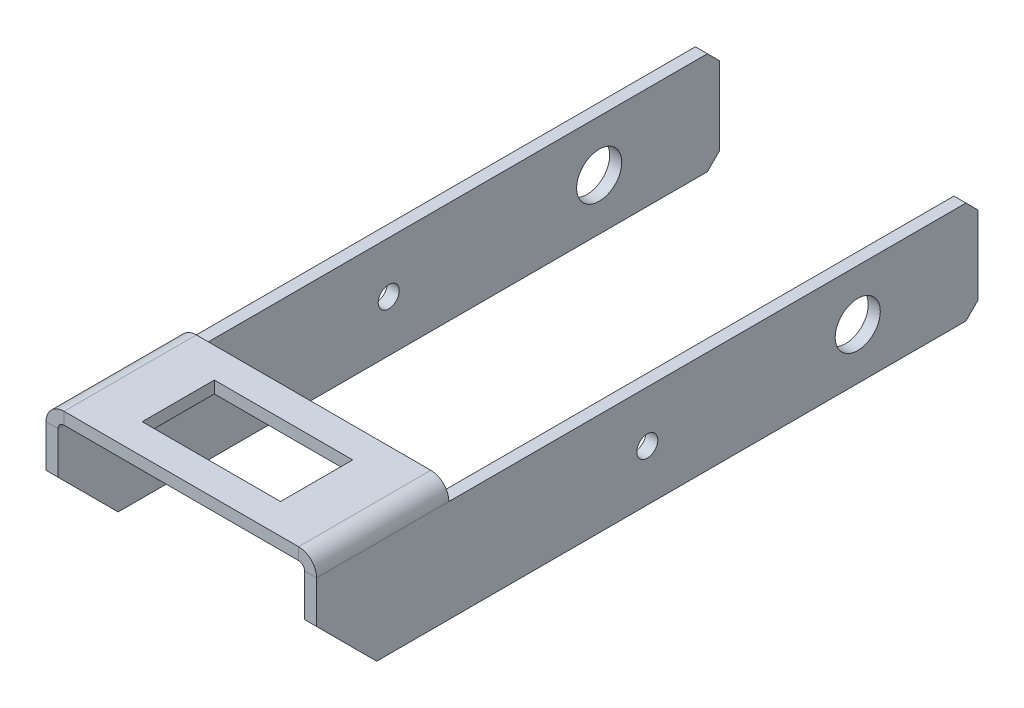
ISO-10303-21;
HEADER;
FILE_DESCRIPTION(('STEP AP214'),'2;1');
FILE_NAME('part.step','',(''),(''),'','','');
FILE_SCHEMA(('AUTOMOTIVE_DESIGN { 1 0 10303 214 1 1 1 1 }'));
ENDSEC;
DATA;
#1=APPLICATION_CONTEXT('core data for automotive mechanical design processes');
#2=APPLICATION_PROTOCOL_DEFINITION('international standard','automotive_design',2000,#1);
#3=PRODUCT_CONTEXT('',#1,'mechanical');
#4=PRODUCT('Part','Part','',(#3));
#5=PRODUCT_RELATED_PRODUCT_CATEGORY('part','',(#4));
#6=PRODUCT_DEFINITION_FORMATION('','',#4);
#7=PRODUCT_DEFINITION_CONTEXT('part definition',#1,'design');
#8=PRODUCT_DEFINITION('design','',#6,#7);
#9=PRODUCT_DEFINITION_SHAPE('','',#8);
#10=(LENGTH_UNIT() NAMED_UNIT(*) SI_UNIT(.MILLI.,.METRE.));
#11=(NAMED_UNIT(*) PLANE_ANGLE_UNIT() SI_UNIT($,.RADIAN.));
#12=(NAMED_UNIT(*) SI_UNIT($,.STERADIAN.) SOLID_ANGLE_UNIT());
#13=UNCERTAINTY_MEASURE_WITH_UNIT(LENGTH_MEASURE(1.E-05),#10,'distance_accuracy_value','');
#14=(GEOMETRIC_REPRESENTATION_CONTEXT(3) GLOBAL_UNCERTAINTY_ASSIGNED_CONTEXT((#13)) GLOBAL_UNIT_ASSIGNED_CONTEXT((#10,
#11,#12)) REPRESENTATION_CONTEXT('',''));
#15=CARTESIAN_POINT('',(0.,0.,0.));
#16=DIRECTION('',(0.,0.,1.));
#17=DIRECTION('',(1.,0.,0.));
#18=AXIS2_PLACEMENT_3D('',#15,#16,#17);
#19=CARTESIAN_POINT('',(0.,2.,0.));
#20=DIRECTION('',(0.,0.,-1.));
#21=DIRECTION('',(-1.,0.,0.));
#22=AXIS2_PLACEMENT_3D('',#19,#20,#21);
#23=PLANE('',#22);
#24=DIRECTION('',(0.,1.,0.));
#25=VECTOR('',#24,1.);
#26=CARTESIAN_POINT('',(3.,0.,0.));
#27=LINE('',#26,#25);
#28=CARTESIAN_POINT('',(3.,0.,0.));
#29=VERTEX_POINT('',#28);
#30=CARTESIAN_POINT('',(3.,2.,0.));
#31=VERTEX_POINT('',#30);
#32=EDGE_CURVE('E348',#29,#31,#27,.T.);
#33=ORIENTED_EDGE('',*,*,#32,.F.);
#34=DIRECTION('',(1.,0.,0.));
#35=VECTOR('',#34,1.);
#36=CARTESIAN_POINT('',(0.,0.,0.));
#37=LINE('',#36,#35);
#38=CARTESIAN_POINT('',(42.,0.,0.));
#39=VERTEX_POINT('',#38);
#40=EDGE_CURVE('E403',#29,#39,#37,.T.);
#41=ORIENTED_EDGE('',*,*,#40,.T.);
#42=DIRECTION('',(0.,1.,0.));
#43=VECTOR('',#42,1.);
#44=CARTESIAN_POINT('',(42.,0.,0.));
#45=LINE('',#44,#43);
#46=CARTESIAN_POINT('',(42.,2.,0.));
#47=VERTEX_POINT('',#46);
#48=EDGE_CURVE('E384',#39,#47,#45,.T.);
#49=ORIENTED_EDGE('',*,*,#48,.T.);
#50=DIRECTION('',(1.,0.,0.));
#51=VECTOR('',#50,1.);
#52=CARTESIAN_POINT('',(0.,2.,0.));
#53=LINE('',#52,#51);
#54=EDGE_CURVE('E405',#31,#47,#53,.T.);
#55=ORIENTED_EDGE('',*,*,#54,.F.);
#56=EDGE_LOOP('',(#33,#41,#49,#55));
#57=FACE_BOUND('',#56,.T.);
#58=ADVANCED_FACE('F87',(#57),#23,.F.);
#59=CARTESIAN_POINT('',(0.,2.,-22.));
#60=DIRECTION('',(0.,0.,1.));
#61=DIRECTION('',(1.,0.,0.));
#62=AXIS2_PLACEMENT_3D('',#59,#60,#61);
#63=PLANE('',#62);
#64=DIRECTION('',(0.,1.,0.));
#65=VECTOR('',#64,1.);
#66=CARTESIAN_POINT('',(3.,0.,-22.));
#67=LINE('',#66,#65);
#68=CARTESIAN_POINT('',(3.,0.,-22.));
#69=VERTEX_POINT('',#68);
#70=CARTESIAN_POINT('',(3.,2.,-22.));
#71=VERTEX_POINT('',#70);
#72=EDGE_CURVE('E334',#69,#71,#67,.T.);
#73=ORIENTED_EDGE('',*,*,#72,.T.);
#74=DIRECTION('',(-1.,0.,0.));
#75=VECTOR('',#74,1.);
#76=CARTESIAN_POINT('',(0.,2.,-22.));
#77=LINE('',#76,#75);
#78=CARTESIAN_POINT('',(42.,2.,-22.));
#79=VERTEX_POINT('',#78);
#80=EDGE_CURVE('E408',#79,#71,#77,.T.);
#81=ORIENTED_EDGE('',*,*,#80,.F.);
#82=DIRECTION('',(0.,1.,0.));
#83=VECTOR('',#82,1.);
#84=CARTESIAN_POINT('',(42.,0.,-22.));
#85=LINE('',#84,#83);
#86=CARTESIAN_POINT('',(42.,0.,-22.));
#87=VERTEX_POINT('',#86);
#88=EDGE_CURVE('E397',#87,#79,#85,.T.);
#89=ORIENTED_EDGE('',*,*,#88,.F.);
#90=DIRECTION('',(-1.,0.,0.));
#91=VECTOR('',#90,1.);
#92=CARTESIAN_POINT('',(0.,0.,-22.));
#93=LINE('',#92,#91);
#94=EDGE_CURVE('E409',#87,#69,#93,.T.);
#95=ORIENTED_EDGE('',*,*,#94,.T.);
#96=EDGE_LOOP('',(#73,#81,#89,#95));
#97=FACE_BOUND('',#96,.T.);
#98=ADVANCED_FACE('F592',(#97),#63,.F.);
#99=CARTESIAN_POINT('',(0.,2.,0.));
#100=DIRECTION('',(0.,-1.,0.));
#101=DIRECTION('',(0.,0.,-1.));
#102=AXIS2_PLACEMENT_3D('',#99,#100,#101);
#103=PLANE('',#102);
#104=DIRECTION('',(-1.,0.,0.));
#105=VECTOR('',#104,1.);
#106=CARTESIAN_POINT('',(11.,2.,-17.));
#107=LINE('',#106,#105);
#108=CARTESIAN_POINT('',(34.,2.,-17.));
#109=VERTEX_POINT('',#108);
#110=CARTESIAN_POINT('',(11.,2.,-17.));
#111=VERTEX_POINT('',#110);
#112=EDGE_CURVE('E265',#109,#111,#107,.T.);
#113=ORIENTED_EDGE('',*,*,#112,.F.);
#114=DIRECTION('',(0.,0.,-1.));
#115=VECTOR('',#114,1.);
#116=CARTESIAN_POINT('',(34.,2.,-5.00000000000001));
#117=LINE('',#116,#115);
#118=CARTESIAN_POINT('',(34.,2.,-5.00000000000001));
#119=VERTEX_POINT('',#118);
#120=EDGE_CURVE('E270',#119,#109,#117,.T.);
#121=ORIENTED_EDGE('',*,*,#120,.F.);
#122=DIRECTION('',(1.,0.,0.));
#123=VECTOR('',#122,1.);
#124=CARTESIAN_POINT('',(11.,2.,-5.00000000000001));
#125=LINE('',#124,#123);
#126=CARTESIAN_POINT('',(11.,2.,-5.00000000000001));
#127=VERTEX_POINT('',#126);
#128=EDGE_CURVE('E275',#127,#119,#125,.T.);
#129=ORIENTED_EDGE('',*,*,#128,.F.);
#130=DIRECTION('',(0.,0.,1.));
#131=VECTOR('',#130,1.);
#132=CARTESIAN_POINT('',(11.,2.,-5.00000000000001));
#133=LINE('',#132,#131);
#134=EDGE_CURVE('E254',#111,#127,#133,.T.);
#135=ORIENTED_EDGE('',*,*,#134,.F.);
#136=EDGE_LOOP('',(#113,#121,#129,#135));
#137=FACE_BOUND('',#136,.T.);
#138=DIRECTION('',(0.,0.,-1.));
#139=VECTOR('',#138,1.);
#140=CARTESIAN_POINT('',(3.,2.,-22.));
#141=LINE('',#140,#139);
#142=EDGE_CURVE('E328',#71,#31,#141,.F.);
#143=ORIENTED_EDGE('',*,*,#142,.T.);
#144=ORIENTED_EDGE('',*,*,#54,.T.);
#145=DIRECTION('',(0.,0.,1.));
#146=VECTOR('',#145,1.);
#147=CARTESIAN_POINT('',(42.,2.,0.));
#148=LINE('',#147,#146);
#149=EDGE_CURVE('E379',#47,#79,#148,.F.);
#150=ORIENTED_EDGE('',*,*,#149,.T.);
#151=ORIENTED_EDGE('',*,*,#80,.T.);
#152=EDGE_LOOP('',(#143,#144,#150,#151));
#153=FACE_BOUND('',#152,.T.);
#154=ADVANCED_FACE('F272',(#137,#153),#103,.F.);
#155=CARTESIAN_POINT('',(0.,0.,0.));
#156=DIRECTION('',(0.,-1.,0.));
#157=DIRECTION('',(0.,0.,-1.));
#158=AXIS2_PLACEMENT_3D('',#155,#156,#157);
#159=PLANE('',#158);
#160=DIRECTION('',(0.,0.,1.));
#161=VECTOR('',#160,1.);
#162=CARTESIAN_POINT('',(34.,0.,0.));
#163=LINE('',#162,#161);
#164=CARTESIAN_POINT('',(34.,0.,-17.));
#165=VERTEX_POINT('',#164);
#166=CARTESIAN_POINT('',(34.,0.,-5.00000000000001));
#167=VERTEX_POINT('',#166);
#168=EDGE_CURVE('E425',#165,#167,#163,.T.);
#169=ORIENTED_EDGE('',*,*,#168,.F.);
#170=DIRECTION('',(1.,0.,0.));
#171=VECTOR('',#170,1.);
#172=CARTESIAN_POINT('',(0.,0.,-17.));
#173=LINE('',#172,#171);
#174=CARTESIAN_POINT('',(11.,0.,-17.));
#175=VERTEX_POINT('',#174);
#176=EDGE_CURVE('E411',#175,#165,#173,.T.);
#177=ORIENTED_EDGE('',*,*,#176,.F.);
#178=DIRECTION('',(0.,0.,-1.));
#179=VECTOR('',#178,1.);
#180=CARTESIAN_POINT('',(11.,0.,0.));
#181=LINE('',#180,#179);
#182=CARTESIAN_POINT('',(11.,0.,-5.00000000000001));
#183=VERTEX_POINT('',#182);
#184=EDGE_CURVE('E257',#183,#175,#181,.T.);
#185=ORIENTED_EDGE('',*,*,#184,.F.);
#186=DIRECTION('',(-1.,0.,0.));
#187=VECTOR('',#186,1.);
#188=CARTESIAN_POINT('',(0.,0.,-5.00000000000001));
#189=LINE('',#188,#187);
#190=EDGE_CURVE('E423',#167,#183,#189,.T.);
#191=ORIENTED_EDGE('',*,*,#190,.F.);
#192=EDGE_LOOP('',(#169,#177,#185,#191));
#193=FACE_BOUND('',#192,.T.);
#194=ORIENTED_EDGE('',*,*,#40,.F.);
#195=DIRECTION('',(0.,0.,-1.));
#196=VECTOR('',#195,1.);
#197=CARTESIAN_POINT('',(3.,0.,-22.));
#198=LINE('',#197,#196);
#199=EDGE_CURVE('E343',#69,#29,#198,.F.);
#200=ORIENTED_EDGE('',*,*,#199,.F.);
#201=ORIENTED_EDGE('',*,*,#94,.F.);
#202=DIRECTION('',(0.,0.,1.));
#203=VECTOR('',#202,1.);
#204=CARTESIAN_POINT('',(42.,0.,0.));
#205=LINE('',#204,#203);
#206=EDGE_CURVE('E390',#39,#87,#205,.F.);
#207=ORIENTED_EDGE('',*,*,#206,.F.);
#208=EDGE_LOOP('',(#194,#200,#201,#207));
#209=FACE_BOUND('',#208,.T.);
#210=ADVANCED_FACE('F871',(#193,#209),#159,.T.);
#211=CARTESIAN_POINT('',(42.,-0.999999999999994,-22.));
#212=DIRECTION('',(0.,0.,-1.));
#213=DIRECTION('',(0.,1.,0.));
#214=AXIS2_PLACEMENT_3D('',#211,#212,#213);
#215=PLANE('',#214);
#216=DIRECTION('',(1.,0.,0.));
#217=VECTOR('',#216,1.);
#218=CARTESIAN_POINT('',(43.,-0.999999999999991,-22.));
#219=LINE('',#218,#217);
#220=CARTESIAN_POINT('',(43.,-0.999999999999991,-22.));
#221=VERTEX_POINT('',#220);
#222=CARTESIAN_POINT('',(45.,-0.999999999999983,-22.));
#223=VERTEX_POINT('',#222);
#224=EDGE_CURVE('E400',#221,#223,#219,.T.);
#225=ORIENTED_EDGE('',*,*,#224,.F.);
#226=CARTESIAN_POINT('',(42.,-0.999999999999994,-22.));
#227=DIRECTION('',(0.,0.,1.));
#228=DIRECTION('',(0.,-1.,0.));
#229=AXIS2_PLACEMENT_3D('',#226,#227,#228);
#230=CIRCLE('',#229,1.);
#231=EDGE_CURVE('E387',#87,#221,#230,.F.);
#232=ORIENTED_EDGE('',*,*,#231,.F.);
#233=ORIENTED_EDGE('',*,*,#88,.T.);
#234=CARTESIAN_POINT('',(42.,-0.999999999999994,-22.));
#235=DIRECTION('',(0.,0.,1.));
#236=DIRECTION('',(0.,-1.,0.));
#237=AXIS2_PLACEMENT_3D('',#234,#235,#236);
#238=CIRCLE('',#237,3.);
#239=EDGE_CURVE('E381',#79,#223,#238,.F.);
#240=ORIENTED_EDGE('',*,*,#239,.T.);
#241=EDGE_LOOP('',(#225,#232,#233,#240));
#242=FACE_BOUND('',#241,.T.);
#243=ADVANCED_FACE('F509',(#242),#215,.T.);
#244=CARTESIAN_POINT('',(42.,-0.999999999999999,0.));
#245=DIRECTION('',(0.,0.,-1.));
#246=DIRECTION('',(0.,1.,0.));
#247=AXIS2_PLACEMENT_3D('',#244,#245,#246);
#248=PLANE('',#247);
#249=CARTESIAN_POINT('',(42.,-0.999999999999999,0.));
#250=DIRECTION('',(0.,0.,1.));
#251=DIRECTION('',(0.,-1.,0.));
#252=AXIS2_PLACEMENT_3D('',#249,#250,#251);
#253=CIRCLE('',#252,1.);
#254=CARTESIAN_POINT('',(43.,-0.999999999999995,0.));
#255=VERTEX_POINT('',#254);
#256=EDGE_CURVE('E393',#255,#39,#253,.T.);
#257=ORIENTED_EDGE('',*,*,#256,.F.);
#258=DIRECTION('',(-1.,0.,0.));
#259=VECTOR('',#258,1.);
#260=CARTESIAN_POINT('',(43.,-0.999999999999994,0.));
#261=LINE('',#260,#259);
#262=CARTESIAN_POINT('',(45.,-0.999999999999989,0.));
#263=VERTEX_POINT('',#262);
#264=EDGE_CURVE('E376',#255,#263,#261,.F.);
#265=ORIENTED_EDGE('',*,*,#264,.T.);
#266=CARTESIAN_POINT('',(42.,-0.999999999999999,0.));
#267=DIRECTION('',(0.,0.,1.));
#268=DIRECTION('',(0.,-1.,0.));
#269=AXIS2_PLACEMENT_3D('',#266,#267,#268);
#270=CIRCLE('',#269,3.);
#271=EDGE_CURVE('E382',#263,#47,#270,.T.);
#272=ORIENTED_EDGE('',*,*,#271,.T.);
#273=ORIENTED_EDGE('',*,*,#48,.F.);
#274=EDGE_LOOP('',(#257,#265,#272,#273));
#275=FACE_BOUND('',#274,.T.);
#276=ADVANCED_FACE('F524',(#275),#248,.F.);
#277=CARTESIAN_POINT('',(42.,-0.999999999999999,0.));
#278=DIRECTION('',(0.,0.,1.));
#279=DIRECTION('',(1.,0.,0.));
#280=AXIS2_PLACEMENT_3D('',#277,#278,#279);
#281=CYLINDRICAL_SURFACE('',#280,3.);
#282=ORIENTED_EDGE('',*,*,#149,.F.);
#283=ORIENTED_EDGE('',*,*,#271,.F.);
#284=DIRECTION('',(0.,0.,1.));
#285=VECTOR('',#284,1.);
#286=CARTESIAN_POINT('',(45.,-0.999999999999966,-110.));
#287=LINE('',#286,#285);
#288=EDGE_CURVE('E372',#263,#223,#287,.F.);
#289=ORIENTED_EDGE('',*,*,#288,.T.);
#290=ORIENTED_EDGE('',*,*,#239,.F.);
#291=EDGE_LOOP('',(#282,#283,#289,#290));
#292=FACE_BOUND('',#291,.T.);
#293=ADVANCED_FACE('F521',(#292),#281,.T.);
#294=CARTESIAN_POINT('',(42.,-0.999999999999999,0.));
#295=DIRECTION('',(0.,0.,1.));
#296=DIRECTION('',(1.,0.,0.));
#297=AXIS2_PLACEMENT_3D('',#294,#295,#296);
#298=CYLINDRICAL_SURFACE('',#297,1.);
#299=ORIENTED_EDGE('',*,*,#206,.T.);
#300=ORIENTED_EDGE('',*,*,#231,.T.);
#301=DIRECTION('',(0.,0.,1.));
#302=VECTOR('',#301,1.);
#303=CARTESIAN_POINT('',(43.,-0.999999999999995,0.));
#304=LINE('',#303,#302);
#305=EDGE_CURVE('E360',#221,#255,#304,.T.);
#306=ORIENTED_EDGE('',*,*,#305,.T.);
#307=ORIENTED_EDGE('',*,*,#256,.T.);
#308=EDGE_LOOP('',(#299,#300,#306,#307));
#309=FACE_BOUND('',#308,.T.);
#310=ADVANCED_FACE('F513',(#309),#298,.F.);
#311=CARTESIAN_POINT('',(45.0000000000001,-18.,0.));
#312=DIRECTION('',(0.,0.,-1.));
#313=DIRECTION('',(-1.,0.,0.));
#314=AXIS2_PLACEMENT_3D('',#311,#312,#313);
#315=PLANE('',#314);
#316=DIRECTION('',(0.,1.,0.));
#317=VECTOR('',#316,1.);
#318=CARTESIAN_POINT('',(43.0000000000001,-18.,0.));
#319=LINE('',#318,#317);
#320=CARTESIAN_POINT('',(43.,-7.99999999999997,0.));
#321=VERTEX_POINT('',#320);
#322=EDGE_CURVE('E370',#255,#321,#319,.F.);
#323=ORIENTED_EDGE('',*,*,#322,.T.);
#324=DIRECTION('',(1.,0.,0.));
#325=VECTOR('',#324,1.);
#326=CARTESIAN_POINT('',(45.,-7.99999999999996,0.));
#327=LINE('',#326,#325);
#328=CARTESIAN_POINT('',(45.,-7.99999999999996,0.));
#329=VERTEX_POINT('',#328);
#330=EDGE_CURVE('E96',#321,#329,#327,.T.);
#331=ORIENTED_EDGE('',*,*,#330,.T.);
#332=DIRECTION('',(0.,-1.,0.));
#333=VECTOR('',#332,1.);
#334=CARTESIAN_POINT('',(45.,1.63108075515599E-13,0.));
#335=LINE('',#334,#333);
#336=EDGE_CURVE('E363',#263,#329,#335,.T.);
#337=ORIENTED_EDGE('',*,*,#336,.F.);
#338=ORIENTED_EDGE('',*,*,#264,.F.);
#339=EDGE_LOOP('',(#323,#331,#337,#338));
#340=FACE_BOUND('',#339,.T.);
#341=ADVANCED_FACE('F517',(#340),#315,.F.);
#342=CARTESIAN_POINT('',(45.,0.,-110.));
#343=DIRECTION('',(0.,0.,1.));
#344=DIRECTION('',(1.,0.,0.));
#345=AXIS2_PLACEMENT_3D('',#342,#343,#344);
#346=PLANE('',#345);
#347=DIRECTION('',(0.,1.,0.));
#348=VECTOR('',#347,1.);
#349=CARTESIAN_POINT('',(45.,1.63108075515599E-13,-110.));
#350=LINE('',#349,#348);
#351=CARTESIAN_POINT('',(45.0000000000001,-16.,-110.));
#352=VERTEX_POINT('',#351);
#353=CARTESIAN_POINT('',(45.,-2.99999999999995,-110.));
#354=VERTEX_POINT('',#353);
#355=EDGE_CURVE('E357',#352,#354,#350,.T.);
#356=ORIENTED_EDGE('',*,*,#355,.F.);
#357=DIRECTION('',(-1.,0.,0.));
#358=VECTOR('',#357,1.);
#359=CARTESIAN_POINT('',(45.0000000000001,-16.,-110.));
#360=LINE('',#359,#358);
#361=CARTESIAN_POINT('',(43.,-16.,-110.));
#362=VERTEX_POINT('',#361);
#363=EDGE_CURVE('E430',#352,#362,#360,.T.);
#364=ORIENTED_EDGE('',*,*,#363,.T.);
#365=DIRECTION('',(0.,-1.,0.));
#366=VECTOR('',#365,1.);
#367=CARTESIAN_POINT('',(43.,0.,-110.));
#368=LINE('',#367,#366);
#369=CARTESIAN_POINT('',(43.,-2.99999999999996,-110.));
#370=VERTEX_POINT('',#369);
#371=EDGE_CURVE('E365',#362,#370,#368,.F.);
#372=ORIENTED_EDGE('',*,*,#371,.T.);
#373=DIRECTION('',(1.,0.,0.));
#374=VECTOR('',#373,1.);
#375=CARTESIAN_POINT('',(45.,-2.99999999999995,-110.));
#376=LINE('',#375,#374);
#377=EDGE_CURVE('E427',#370,#354,#376,.T.);
#378=ORIENTED_EDGE('',*,*,#377,.T.);
#379=EDGE_LOOP('',(#356,#364,#372,#378));
#380=FACE_BOUND('',#379,.T.);
#381=ADVANCED_FACE('F494',(#380),#346,.F.);
#382=CARTESIAN_POINT('',(45.,1.63108075515599E-13,0.));
#383=DIRECTION('',(-1.,0.,0.));
#384=DIRECTION('',(0.,-1.,0.));
#385=AXIS2_PLACEMENT_3D('',#382,#383,#384);
#386=PLANE('',#385);
#387=CARTESIAN_POINT('',(45.0000000000001,-9.50000000000016,-55.));
#388=DIRECTION('',(-1.,0.,0.));
#389=DIRECTION('',(0.,-1.,0.));
#390=AXIS2_PLACEMENT_3D('',#387,#388,#389);
#391=CIRCLE('',#390,1.75);
#392=CARTESIAN_POINT('',(45.0000000000001,-11.2500000000002,-55.));
#393=VERTEX_POINT('',#392);
#394=EDGE_CURVE('E285',#393,#393,#391,.T.);
#395=ORIENTED_EDGE('',*,*,#394,.T.);
#396=EDGE_LOOP('',(#395));
#397=FACE_BOUND('',#396,.T.);
#398=CARTESIAN_POINT('',(45.,-9.49999999999997,-90.));
#399=DIRECTION('',(1.,0.,0.));
#400=DIRECTION('',(0.,1.,0.));
#401=AXIS2_PLACEMENT_3D('',#398,#399,#400);
#402=CIRCLE('',#401,3.75000000000001);
#403=CARTESIAN_POINT('',(45.,-5.74999999999996,-90.));
#404=VERTEX_POINT('',#403);
#405=EDGE_CURVE('E298',#404,#404,#402,.T.);
#406=ORIENTED_EDGE('',*,*,#405,.F.);
#407=EDGE_LOOP('',(#406));
#408=FACE_BOUND('',#407,.T.);
#409=ORIENTED_EDGE('',*,*,#336,.T.);
#410=DIRECTION('',(0.,0.707106781186549,0.707106781186546));
#411=VECTOR('',#410,1.);
#412=CARTESIAN_POINT('',(45.0000000000001,-18.,-9.99999999999999));
#413=LINE('',#412,#411);
#414=CARTESIAN_POINT('',(45.0000000000001,-18.,-9.99999999999999));
#415=VERTEX_POINT('',#414);
#416=EDGE_CURVE('E13',#329,#415,#413,.F.);
#417=ORIENTED_EDGE('',*,*,#416,.T.);
#418=DIRECTION('',(0.,0.,-1.));
#419=VECTOR('',#418,1.);
#420=CARTESIAN_POINT('',(45.0000000000001,-18.,0.));
#421=LINE('',#420,#419);
#422=CARTESIAN_POINT('',(45.0000000000001,-18.,-108.));
#423=VERTEX_POINT('',#422);
#424=EDGE_CURVE('E361',#415,#423,#421,.T.);
#425=ORIENTED_EDGE('',*,*,#424,.T.);
#426=DIRECTION('',(0.,-0.707106781186545,0.70710678118655));
#427=VECTOR('',#426,1.);
#428=CARTESIAN_POINT('',(45.0000000000001,-16.,-110.));
#429=LINE('',#428,#427);
#430=EDGE_CURVE('E443',#423,#352,#429,.F.);
#431=ORIENTED_EDGE('',*,*,#430,.T.);
#432=ORIENTED_EDGE('',*,*,#355,.T.);
#433=DIRECTION('',(0.,0.707106781186545,0.70710678118655));
#434=VECTOR('',#433,1.);
#435=CARTESIAN_POINT('',(45.,-2.99999999999995,-110.));
#436=LINE('',#435,#434);
#437=CARTESIAN_POINT('',(45.,-0.999999999999967,-108.));
#438=VERTEX_POINT('',#437);
#439=EDGE_CURVE('E441',#354,#438,#436,.T.);
#440=ORIENTED_EDGE('',*,*,#439,.T.);
#441=EDGE_CURVE('E375',#223,#438,#287,.F.);
#442=ORIENTED_EDGE('',*,*,#441,.F.);
#443=ORIENTED_EDGE('',*,*,#288,.F.);
#444=EDGE_LOOP('',(#409,#417,#425,#431,#432,#440,#442,#443));
#445=FACE_BOUND('',#444,.T.);
#446=ADVANCED_FACE('F492',(#397,#408,#445),#386,.F.);
#447=CARTESIAN_POINT('',(43.,1.56125112837913E-13,0.));
#448=DIRECTION('',(-1.,0.,0.));
#449=DIRECTION('',(0.,-1.,0.));
#450=AXIS2_PLACEMENT_3D('',#447,#448,#449);
#451=PLANE('',#450);
#452=CARTESIAN_POINT('',(43.,-9.50000000000015,-55.));
#453=DIRECTION('',(-1.,0.,0.));
#454=DIRECTION('',(0.,-1.,0.));
#455=AXIS2_PLACEMENT_3D('',#452,#453,#454);
#456=CIRCLE('',#455,1.75);
#457=CARTESIAN_POINT('',(43.,-11.2500000000002,-55.));
#458=VERTEX_POINT('',#457);
#459=EDGE_CURVE('E291',#458,#458,#456,.T.);
#460=ORIENTED_EDGE('',*,*,#459,.F.);
#461=EDGE_LOOP('',(#460));
#462=FACE_BOUND('',#461,.T.);
#463=CARTESIAN_POINT('',(43.,-9.49999999999998,-90.));
#464=DIRECTION('',(-1.,0.,0.));
#465=DIRECTION('',(0.,-1.,0.));
#466=AXIS2_PLACEMENT_3D('',#463,#464,#465);
#467=CIRCLE('',#466,3.75000000000001);
#468=CARTESIAN_POINT('',(43.,-13.25,-90.));
#469=VERTEX_POINT('',#468);
#470=EDGE_CURVE('E301',#469,#469,#467,.T.);
#471=ORIENTED_EDGE('',*,*,#470,.F.);
#472=EDGE_LOOP('',(#471));
#473=FACE_BOUND('',#472,.T.);
#474=DIRECTION('',(0.,0.,1.));
#475=VECTOR('',#474,1.);
#476=CARTESIAN_POINT('',(43.0000000000001,-18.,-110.));
#477=LINE('',#476,#475);
#478=CARTESIAN_POINT('',(43.0000000000001,-18.,-9.99999999999999));
#479=VERTEX_POINT('',#478);
#480=CARTESIAN_POINT('',(43.0000000000001,-18.,-108.));
#481=VERTEX_POINT('',#480);
#482=EDGE_CURVE('E368',#479,#481,#477,.F.);
#483=ORIENTED_EDGE('',*,*,#482,.F.);
#484=DIRECTION('',(0.,-0.707106781186549,-0.707106781186546));
#485=VECTOR('',#484,1.);
#486=CARTESIAN_POINT('',(43.,-3.99999999999989,4.00000000000006));
#487=LINE('',#486,#485);
#488=EDGE_CURVE('E110',#479,#321,#487,.F.);
#489=ORIENTED_EDGE('',*,*,#488,.T.);
#490=ORIENTED_EDGE('',*,*,#322,.F.);
#491=ORIENTED_EDGE('',*,*,#305,.F.);
#492=DIRECTION('',(0.,0.,1.));
#493=VECTOR('',#492,1.);
#494=CARTESIAN_POINT('',(43.,-0.999999999999973,-110.));
#495=LINE('',#494,#493);
#496=CARTESIAN_POINT('',(43.,-0.999999999999974,-108.));
#497=VERTEX_POINT('',#496);
#498=EDGE_CURVE('E354',#497,#221,#495,.T.);
#499=ORIENTED_EDGE('',*,*,#498,.F.);
#500=DIRECTION('',(0.,-0.707106781186545,-0.70710678118655));
#501=VECTOR('',#500,1.);
#502=CARTESIAN_POINT('',(42.9999999999998,53.5000000000001,-53.4999999999996));
#503=LINE('',#502,#501);
#504=EDGE_CURVE('E433',#497,#370,#503,.T.);
#505=ORIENTED_EDGE('',*,*,#504,.T.);
#506=ORIENTED_EDGE('',*,*,#371,.F.);
#507=DIRECTION('',(0.,0.707106781186545,-0.70710678118655));
#508=VECTOR('',#507,1.);
#509=CARTESIAN_POINT('',(43.0000000000002,-63.,-62.9999999999997));
#510=LINE('',#509,#508);
#511=EDGE_CURVE('E435',#362,#481,#510,.F.);
#512=ORIENTED_EDGE('',*,*,#511,.T.);
#513=EDGE_LOOP('',(#483,#489,#490,#491,#499,#505,#506,#512));
#514=FACE_BOUND('',#513,.T.);
#515=ADVANCED_FACE('F483',(#462,#473,#514),#451,.T.);
#516=CARTESIAN_POINT('',(45.0000000000001,-18.,-110.));
#517=DIRECTION('',(0.,1.,0.));
#518=DIRECTION('',(-1.,0.,0.));
#519=AXIS2_PLACEMENT_3D('',#516,#517,#518);
#520=PLANE('',#519);
#521=ORIENTED_EDGE('',*,*,#424,.F.);
#522=DIRECTION('',(-1.,0.,0.));
#523=VECTOR('',#522,1.);
#524=CARTESIAN_POINT('',(45.0000000000001,-18.,-9.99999999999999));
#525=LINE('',#524,#523);
#526=EDGE_CURVE('E474',#415,#479,#525,.T.);
#527=ORIENTED_EDGE('',*,*,#526,.T.);
#528=ORIENTED_EDGE('',*,*,#482,.T.);
#529=DIRECTION('',(1.,0.,0.));
#530=VECTOR('',#529,1.);
#531=CARTESIAN_POINT('',(45.0000000000001,-18.,-108.));
#532=LINE('',#531,#530);
#533=EDGE_CURVE('E438',#481,#423,#532,.T.);
#534=ORIENTED_EDGE('',*,*,#533,.T.);
#535=EDGE_LOOP('',(#521,#527,#528,#534));
#536=FACE_BOUND('',#535,.T.);
#537=ADVANCED_FACE('F480',(#536),#520,.F.);
#538=CARTESIAN_POINT('',(43.,-0.999999999999973,-110.));
#539=DIRECTION('',(0.,1.,0.));
#540=DIRECTION('',(-1.,0.,0.));
#541=AXIS2_PLACEMENT_3D('',#538,#539,#540);
#542=PLANE('',#541);
#543=ORIENTED_EDGE('',*,*,#441,.T.);
#544=DIRECTION('',(-1.,0.,0.));
#545=VECTOR('',#544,1.);
#546=CARTESIAN_POINT('',(43.,-0.999999999999974,-108.));
#547=LINE('',#546,#545);
#548=EDGE_CURVE('E445',#438,#497,#547,.T.);
#549=ORIENTED_EDGE('',*,*,#548,.T.);
#550=ORIENTED_EDGE('',*,*,#498,.T.);
#551=ORIENTED_EDGE('',*,*,#224,.T.);
#552=EDGE_LOOP('',(#543,#549,#550,#551));
#553=FACE_BOUND('',#552,.T.);
#554=ADVANCED_FACE('F504',(#553),#542,.T.);
#555=CARTESIAN_POINT('',(3.,-0.999999999999996,0.));
#556=DIRECTION('',(0.,0.,1.));
#557=DIRECTION('',(0.,-1.,0.));
#558=AXIS2_PLACEMENT_3D('',#555,#556,#557);
#559=PLANE('',#558);
#560=DIRECTION('',(1.,0.,0.));
#561=VECTOR('',#560,1.);
#562=CARTESIAN_POINT('',(0.,-0.99999999999999,0.));
#563=LINE('',#562,#561);
#564=CARTESIAN_POINT('',(2.,-0.999999999999997,0.));
#565=VERTEX_POINT('',#564);
#566=CARTESIAN_POINT('',(0.,-0.99999999999999,0.));
#567=VERTEX_POINT('',#566);
#568=EDGE_CURVE('E325',#565,#567,#563,.F.);
#569=ORIENTED_EDGE('',*,*,#568,.F.);
#570=CARTESIAN_POINT('',(3.,-0.999999999999996,0.));
#571=DIRECTION('',(0.,0.,-1.));
#572=DIRECTION('',(0.,1.,0.));
#573=AXIS2_PLACEMENT_3D('',#570,#571,#572);
#574=CIRCLE('',#573,1.);
#575=EDGE_CURVE('E338',#29,#565,#574,.F.);
#576=ORIENTED_EDGE('',*,*,#575,.F.);
#577=ORIENTED_EDGE('',*,*,#32,.T.);
#578=CARTESIAN_POINT('',(3.,-0.999999999999996,0.));
#579=DIRECTION('',(0.,0.,-1.));
#580=DIRECTION('',(0.,1.,0.));
#581=AXIS2_PLACEMENT_3D('',#578,#579,#580);
#582=CIRCLE('',#581,3.);
#583=EDGE_CURVE('E330',#31,#567,#582,.F.);
#584=ORIENTED_EDGE('',*,*,#583,.T.);
#585=EDGE_LOOP('',(#569,#576,#577,#584));
#586=FACE_BOUND('',#585,.T.);
#587=ADVANCED_FACE('F556',(#586),#559,.T.);
#588=CARTESIAN_POINT('',(3.,-1.,-22.));
#589=DIRECTION('',(0.,0.,1.));
#590=DIRECTION('',(0.,-1.,0.));
#591=AXIS2_PLACEMENT_3D('',#588,#589,#590);
#592=PLANE('',#591);
#593=CARTESIAN_POINT('',(3.,-1.,-22.));
#594=DIRECTION('',(0.,0.,-1.));
#595=DIRECTION('',(0.,1.,0.));
#596=AXIS2_PLACEMENT_3D('',#593,#594,#595);
#597=CIRCLE('',#596,1.);
#598=CARTESIAN_POINT('',(2.,-1.,-22.));
#599=VERTEX_POINT('',#598);
#600=EDGE_CURVE('E304',#599,#69,#597,.T.);
#601=ORIENTED_EDGE('',*,*,#600,.F.);
#602=DIRECTION('',(-1.,0.,0.));
#603=VECTOR('',#602,1.);
#604=CARTESIAN_POINT('',(2.,-0.999999999999997,-22.));
#605=LINE('',#604,#603);
#606=CARTESIAN_POINT('',(0.,-0.99999999999999,-22.));
#607=VERTEX_POINT('',#606);
#608=EDGE_CURVE('E351',#599,#607,#605,.T.);
#609=ORIENTED_EDGE('',*,*,#608,.T.);
#610=CARTESIAN_POINT('',(3.,-1.,-22.));
#611=DIRECTION('',(0.,0.,-1.));
#612=DIRECTION('',(0.,1.,0.));
#613=AXIS2_PLACEMENT_3D('',#610,#611,#612);
#614=CIRCLE('',#613,3.);
#615=EDGE_CURVE('E331',#607,#71,#614,.T.);
#616=ORIENTED_EDGE('',*,*,#615,.T.);
#617=ORIENTED_EDGE('',*,*,#72,.F.);
#618=EDGE_LOOP('',(#601,#609,#616,#617));
#619=FACE_BOUND('',#618,.T.);
#620=ADVANCED_FACE('F538',(#619),#592,.F.);
#621=CARTESIAN_POINT('',(3.,-1.,-22.));
#622=DIRECTION('',(0.,0.,-1.));
#623=DIRECTION('',(-1.,0.,0.));
#624=AXIS2_PLACEMENT_3D('',#621,#622,#623);
#625=CYLINDRICAL_SURFACE('',#624,3.);
#626=ORIENTED_EDGE('',*,*,#142,.F.);
#627=ORIENTED_EDGE('',*,*,#615,.F.);
#628=DIRECTION('',(0.,0.,-1.));
#629=VECTOR('',#628,1.);
#630=CARTESIAN_POINT('',(0.,-0.99999999999999,-22.));
#631=LINE('',#630,#629);
#632=EDGE_CURVE('E335',#567,#607,#631,.T.);
#633=ORIENTED_EDGE('',*,*,#632,.F.);
#634=ORIENTED_EDGE('',*,*,#583,.F.);
#635=EDGE_LOOP('',(#626,#627,#633,#634));
#636=FACE_BOUND('',#635,.T.);
#637=ADVANCED_FACE('F533',(#636),#625,.T.);
#638=CARTESIAN_POINT('',(3.,-1.,-22.));
#639=DIRECTION('',(0.,0.,-1.));
#640=DIRECTION('',(-1.,0.,0.));
#641=AXIS2_PLACEMENT_3D('',#638,#639,#640);
#642=CYLINDRICAL_SURFACE('',#641,1.);
#643=ORIENTED_EDGE('',*,*,#199,.T.);
#644=ORIENTED_EDGE('',*,*,#575,.T.);
#645=DIRECTION('',(0.,0.,-1.));
#646=VECTOR('',#645,1.);
#647=CARTESIAN_POINT('',(2.,-0.999999999999997,0.));
#648=LINE('',#647,#646);
#649=EDGE_CURVE('E321',#565,#599,#648,.T.);
#650=ORIENTED_EDGE('',*,*,#649,.T.);
#651=ORIENTED_EDGE('',*,*,#600,.T.);
#652=EDGE_LOOP('',(#643,#644,#650,#651));
#653=FACE_BOUND('',#652,.T.);
#654=ADVANCED_FACE('F553',(#653),#642,.F.);
#655=CARTESIAN_POINT('',(2.,-0.999999999999997,0.));
#656=DIRECTION('',(0.,1.,0.));
#657=DIRECTION('',(-1.,0.,0.));
#658=AXIS2_PLACEMENT_3D('',#655,#656,#657);
#659=PLANE('',#658);
#660=CARTESIAN_POINT('',(2.,-1.00000000000001,-108.));
#661=VERTEX_POINT('',#660);
#662=EDGE_CURVE('E324',#599,#661,#648,.T.);
#663=ORIENTED_EDGE('',*,*,#662,.T.);
#664=DIRECTION('',(-1.,0.,0.));
#665=VECTOR('',#664,1.);
#666=CARTESIAN_POINT('',(0.,-1.00000000000001,-108.));
#667=LINE('',#666,#665);
#668=CARTESIAN_POINT('',(0.,-1.00000000000001,-108.));
#669=VERTEX_POINT('',#668);
#670=EDGE_CURVE('E462',#661,#669,#667,.T.);
#671=ORIENTED_EDGE('',*,*,#670,.T.);
#672=DIRECTION('',(0.,0.,-1.));
#673=VECTOR('',#672,1.);
#674=CARTESIAN_POINT('',(0.,-0.99999999999999,0.));
#675=LINE('',#674,#673);
#676=EDGE_CURVE('E319',#669,#607,#675,.F.);
#677=ORIENTED_EDGE('',*,*,#676,.T.);
#678=ORIENTED_EDGE('',*,*,#608,.F.);
#679=EDGE_LOOP('',(#663,#671,#677,#678));
#680=FACE_BOUND('',#679,.T.);
#681=ADVANCED_FACE('F542',(#680),#659,.T.);
#682=CARTESIAN_POINT('',(0.,-18.,-110.));
#683=DIRECTION('',(0.,0.,1.));
#684=DIRECTION('',(1.,0.,0.));
#685=AXIS2_PLACEMENT_3D('',#682,#683,#684);
#686=PLANE('',#685);
#687=DIRECTION('',(0.,1.,0.));
#688=VECTOR('',#687,1.);
#689=CARTESIAN_POINT('',(1.99999999999994,-18.,-110.));
#690=LINE('',#689,#688);
#691=CARTESIAN_POINT('',(1.99999999999999,-3.00000000000003,-110.));
#692=VERTEX_POINT('',#691);
#693=CARTESIAN_POINT('',(1.99999999999994,-16.,-110.));
#694=VERTEX_POINT('',#693);
#695=EDGE_CURVE('E316',#692,#694,#690,.F.);
#696=ORIENTED_EDGE('',*,*,#695,.T.);
#697=DIRECTION('',(-1.,0.,0.));
#698=VECTOR('',#697,1.);
#699=CARTESIAN_POINT('',(0.,-16.,-110.));
#700=LINE('',#699,#698);
#701=CARTESIAN_POINT('',(0.,-16.,-110.));
#702=VERTEX_POINT('',#701);
#703=EDGE_CURVE('E456',#694,#702,#700,.T.);
#704=ORIENTED_EDGE('',*,*,#703,.T.);
#705=DIRECTION('',(0.,-1.,0.));
#706=VECTOR('',#705,1.);
#707=CARTESIAN_POINT('',(0.,0.,-110.));
#708=LINE('',#707,#706);
#709=CARTESIAN_POINT('',(0.,-3.00000000000002,-110.));
#710=VERTEX_POINT('',#709);
#711=EDGE_CURVE('E308',#710,#702,#708,.T.);
#712=ORIENTED_EDGE('',*,*,#711,.F.);
#713=DIRECTION('',(1.,0.,0.));
#714=VECTOR('',#713,1.);
#715=CARTESIAN_POINT('',(1.99999999999999,-3.00000000000003,-110.));
#716=LINE('',#715,#714);
#717=EDGE_CURVE('E454',#710,#692,#716,.T.);
#718=ORIENTED_EDGE('',*,*,#717,.T.);
#719=EDGE_LOOP('',(#696,#704,#712,#718));
#720=FACE_BOUND('',#719,.T.);
#721=ADVANCED_FACE('F577',(#720),#686,.F.);
#722=CARTESIAN_POINT('',(0.,0.,0.));
#723=DIRECTION('',(0.,0.,-1.));
#724=DIRECTION('',(-1.,0.,0.));
#725=AXIS2_PLACEMENT_3D('',#722,#723,#724);
#726=PLANE('',#725);
#727=DIRECTION('',(0.,1.,0.));
#728=VECTOR('',#727,1.);
#729=CARTESIAN_POINT('',(0.,0.,0.));
#730=LINE('',#729,#728);
#731=CARTESIAN_POINT('',(0.,-8.00000000000002,0.));
#732=VERTEX_POINT('',#731);
#733=EDGE_CURVE('E302',#732,#567,#730,.T.);
#734=ORIENTED_EDGE('',*,*,#733,.F.);
#735=DIRECTION('',(1.,0.,0.));
#736=VECTOR('',#735,1.);
#737=CARTESIAN_POINT('',(0.,-8.00000000000002,0.));
#738=LINE('',#737,#736);
#739=CARTESIAN_POINT('',(1.99999999999997,-8.00000000000003,0.));
#740=VERTEX_POINT('',#739);
#741=EDGE_CURVE('E465',#732,#740,#738,.T.);
#742=ORIENTED_EDGE('',*,*,#741,.T.);
#743=DIRECTION('',(0.,-1.,0.));
#744=VECTOR('',#743,1.);
#745=CARTESIAN_POINT('',(2.,0.,0.));
#746=LINE('',#745,#744);
#747=EDGE_CURVE('E311',#740,#565,#746,.F.);
#748=ORIENTED_EDGE('',*,*,#747,.T.);
#749=ORIENTED_EDGE('',*,*,#568,.T.);
#750=EDGE_LOOP('',(#734,#742,#748,#749));
#751=FACE_BOUND('',#750,.T.);
#752=ADVANCED_FACE('F559',(#751),#726,.F.);
#753=CARTESIAN_POINT('',(0.,0.,0.));
#754=DIRECTION('',(1.,0.,0.));
#755=DIRECTION('',(0.,1.,0.));
#756=AXIS2_PLACEMENT_3D('',#753,#754,#755);
#757=PLANE('',#756);
#758=CARTESIAN_POINT('',(0.,-9.5,-55.));
#759=DIRECTION('',(-1.,0.,0.));
#760=DIRECTION('',(0.,-1.,0.));
#761=AXIS2_PLACEMENT_3D('',#758,#759,#760);
#762=CIRCLE('',#761,1.75);
#763=CARTESIAN_POINT('',(0.,-11.25,-55.));
#764=VERTEX_POINT('',#763);
#765=EDGE_CURVE('E282',#764,#764,#762,.T.);
#766=ORIENTED_EDGE('',*,*,#765,.F.);
#767=EDGE_LOOP('',(#766));
#768=FACE_BOUND('',#767,.T.);
#769=CARTESIAN_POINT('',(0.,-9.5,-90.));
#770=DIRECTION('',(-1.,0.,0.));
#771=DIRECTION('',(0.,-1.,0.));
#772=AXIS2_PLACEMENT_3D('',#769,#770,#771);
#773=CIRCLE('',#772,3.75000000000001);
#774=CARTESIAN_POINT('',(0.,-13.25,-90.));
#775=VERTEX_POINT('',#774);
#776=EDGE_CURVE('E294',#775,#775,#773,.T.);
#777=ORIENTED_EDGE('',*,*,#776,.F.);
#778=EDGE_LOOP('',(#777));
#779=FACE_BOUND('',#778,.T.);
#780=DIRECTION('',(0.,0.,1.));
#781=VECTOR('',#780,1.);
#782=CARTESIAN_POINT('',(0.,-18.,0.));
#783=LINE('',#782,#781);
#784=CARTESIAN_POINT('',(0.,-18.,-108.));
#785=VERTEX_POINT('',#784);
#786=CARTESIAN_POINT('',(0.,-18.,-10.));
#787=VERTEX_POINT('',#786);
#788=EDGE_CURVE('E305',#785,#787,#783,.T.);
#789=ORIENTED_EDGE('',*,*,#788,.T.);
#790=DIRECTION('',(0.,-0.707106781186546,-0.707106781186549));
#791=VECTOR('',#790,1.);
#792=CARTESIAN_POINT('',(0.,-8.00000000000002,0.));
#793=LINE('',#792,#791);
#794=EDGE_CURVE('E472',#787,#732,#793,.F.);
#795=ORIENTED_EDGE('',*,*,#794,.T.);
#796=ORIENTED_EDGE('',*,*,#733,.T.);
#797=ORIENTED_EDGE('',*,*,#632,.T.);
#798=ORIENTED_EDGE('',*,*,#676,.F.);
#799=DIRECTION('',(0.,-0.70710678118655,-0.707106781186545));
#800=VECTOR('',#799,1.);
#801=CARTESIAN_POINT('',(0.,-1.00000000000001,-108.));
#802=LINE('',#801,#800);
#803=EDGE_CURVE('E458',#669,#710,#802,.T.);
#804=ORIENTED_EDGE('',*,*,#803,.T.);
#805=ORIENTED_EDGE('',*,*,#711,.T.);
#806=DIRECTION('',(0.,0.70710678118655,-0.707106781186545));
#807=VECTOR('',#806,1.);
#808=CARTESIAN_POINT('',(0.,-18.,-108.));
#809=LINE('',#808,#807);
#810=EDGE_CURVE('E460',#702,#785,#809,.F.);
#811=ORIENTED_EDGE('',*,*,#810,.T.);
#812=EDGE_LOOP('',(#789,#795,#796,#797,#798,#804,#805,#811));
#813=FACE_BOUND('',#812,.T.);
#814=ADVANCED_FACE('F562',(#768,#779,#813),#757,.F.);
#815=CARTESIAN_POINT('',(2.,0.,0.));
#816=DIRECTION('',(1.,0.,0.));
#817=DIRECTION('',(0.,1.,0.));
#818=AXIS2_PLACEMENT_3D('',#815,#816,#817);
#819=PLANE('',#818);
#820=CARTESIAN_POINT('',(1.99999999999997,-9.50000000000001,-55.));
#821=DIRECTION('',(1.,0.,0.));
#822=DIRECTION('',(0.,1.,0.));
#823=AXIS2_PLACEMENT_3D('',#820,#821,#822);
#824=CIRCLE('',#823,1.75);
#825=CARTESIAN_POINT('',(1.99999999999997,-7.75000000000001,-55.));
#826=VERTEX_POINT('',#825);
#827=EDGE_CURVE('E288',#826,#826,#824,.T.);
#828=ORIENTED_EDGE('',*,*,#827,.F.);
#829=EDGE_LOOP('',(#828));
#830=FACE_BOUND('',#829,.T.);
#831=CARTESIAN_POINT('',(1.99999999999997,-9.50000000000001,-90.));
#832=DIRECTION('',(1.,0.,0.));
#833=DIRECTION('',(0.,1.,0.));
#834=AXIS2_PLACEMENT_3D('',#831,#832,#833);
#835=CIRCLE('',#834,3.75000000000001);
#836=CARTESIAN_POINT('',(1.99999999999998,-5.75,-90.));
#837=VERTEX_POINT('',#836);
#838=EDGE_CURVE('E297',#837,#837,#835,.T.);
#839=ORIENTED_EDGE('',*,*,#838,.F.);
#840=EDGE_LOOP('',(#839));
#841=FACE_BOUND('',#840,.T.);
#842=ORIENTED_EDGE('',*,*,#747,.F.);
#843=DIRECTION('',(0.,0.707106781186546,0.707106781186549));
#844=VECTOR('',#843,1.);
#845=CARTESIAN_POINT('',(1.99999999999999,-4.00000000000003,4.00000000000001));
#846=LINE('',#845,#844);
#847=CARTESIAN_POINT('',(1.99999999999994,-18.,-10.));
#848=VERTEX_POINT('',#847);
#849=EDGE_CURVE('E468',#740,#848,#846,.F.);
#850=ORIENTED_EDGE('',*,*,#849,.T.);
#851=DIRECTION('',(0.,0.,-1.));
#852=VECTOR('',#851,1.);
#853=CARTESIAN_POINT('',(1.99999999999994,-18.,0.));
#854=LINE('',#853,#852);
#855=CARTESIAN_POINT('',(1.99999999999994,-18.,-108.));
#856=VERTEX_POINT('',#855);
#857=EDGE_CURVE('E313',#856,#848,#854,.F.);
#858=ORIENTED_EDGE('',*,*,#857,.F.);
#859=DIRECTION('',(0.,-0.70710678118655,0.707106781186545));
#860=VECTOR('',#859,1.);
#861=CARTESIAN_POINT('',(1.99999999999978,-63.,-63.0000000000004));
#862=LINE('',#861,#860);
#863=EDGE_CURVE('E452',#856,#694,#862,.F.);
#864=ORIENTED_EDGE('',*,*,#863,.T.);
#865=ORIENTED_EDGE('',*,*,#695,.F.);
#866=DIRECTION('',(0.,0.70710678118655,0.707106781186545));
#867=VECTOR('',#866,1.);
#868=CARTESIAN_POINT('',(2.00000000000019,53.5,-53.5000000000004));
#869=LINE('',#868,#867);
#870=EDGE_CURVE('E450',#692,#661,#869,.T.);
#871=ORIENTED_EDGE('',*,*,#870,.T.);
#872=ORIENTED_EDGE('',*,*,#662,.F.);
#873=ORIENTED_EDGE('',*,*,#649,.F.);
#874=EDGE_LOOP('',(#842,#850,#858,#864,#865,#871,#872,#873));
#875=FACE_BOUND('',#874,.T.);
#876=ADVANCED_FACE('F548',(#830,#841,#875),#819,.T.);
#877=CARTESIAN_POINT('',(0.,-18.,0.));
#878=DIRECTION('',(0.,1.,0.));
#879=DIRECTION('',(-1.,0.,0.));
#880=AXIS2_PLACEMENT_3D('',#877,#878,#879);
#881=PLANE('',#880);
#882=ORIENTED_EDGE('',*,*,#857,.T.);
#883=DIRECTION('',(-1.,0.,0.));
#884=VECTOR('',#883,1.);
#885=CARTESIAN_POINT('',(0.,-18.,-10.));
#886=LINE('',#885,#884);
#887=EDGE_CURVE('E470',#848,#787,#886,.T.);
#888=ORIENTED_EDGE('',*,*,#887,.T.);
#889=ORIENTED_EDGE('',*,*,#788,.F.);
#890=DIRECTION('',(1.,0.,0.));
#891=VECTOR('',#890,1.);
#892=CARTESIAN_POINT('',(0.,-18.,-108.));
#893=LINE('',#892,#891);
#894=EDGE_CURVE('E447',#785,#856,#893,.T.);
#895=ORIENTED_EDGE('',*,*,#894,.T.);
#896=EDGE_LOOP('',(#882,#888,#889,#895));
#897=FACE_BOUND('',#896,.T.);
#898=ADVANCED_FACE('F570',(#897),#881,.F.);
#899=CARTESIAN_POINT('',(35.,-9.5,-90.));
#900=DIRECTION('',(1.,0.,0.));
#901=DIRECTION('',(0.,1.,0.));
#902=AXIS2_PLACEMENT_3D('',#899,#900,#901);
#903=CYLINDRICAL_SURFACE('',#902,3.75000000000001);
#904=ORIENTED_EDGE('',*,*,#470,.T.);
#905=EDGE_LOOP('',(#904));
#906=FACE_BOUND('',#905,.T.);
#907=ORIENTED_EDGE('',*,*,#405,.T.);
#908=EDGE_LOOP('',(#907));
#909=FACE_BOUND('',#908,.T.);
#910=ADVANCED_FACE('F655',(#906,#909),#903,.F.);
#911=CARTESIAN_POINT('',(9.99999999999997,-9.50000000000004,-90.));
#912=DIRECTION('',(-1.,0.,0.));
#913=DIRECTION('',(0.,-1.,0.));
#914=AXIS2_PLACEMENT_3D('',#911,#912,#913);
#915=CYLINDRICAL_SURFACE('',#914,3.75000000000001);
#916=ORIENTED_EDGE('',*,*,#838,.T.);
#917=EDGE_LOOP('',(#916));
#918=FACE_BOUND('',#917,.T.);
#919=ORIENTED_EDGE('',*,*,#776,.T.);
#920=EDGE_LOOP('',(#919));
#921=FACE_BOUND('',#920,.T.);
#922=ADVANCED_FACE('F779',(#918,#921),#915,.F.);
#923=CARTESIAN_POINT('',(45.0000000000001,-9.50000000000016,-55.));
#924=DIRECTION('',(-1.,0.,0.));
#925=DIRECTION('',(0.,-1.,0.));
#926=AXIS2_PLACEMENT_3D('',#923,#924,#925);
#927=CYLINDRICAL_SURFACE('',#926,1.75);
#928=ORIENTED_EDGE('',*,*,#827,.T.);
#929=EDGE_LOOP('',(#928));
#930=FACE_BOUND('',#929,.T.);
#931=ORIENTED_EDGE('',*,*,#765,.T.);
#932=EDGE_LOOP('',(#931));
#933=FACE_BOUND('',#932,.T.);
#934=ADVANCED_FACE('F790',(#930,#933),#927,.F.);
#935=ORIENTED_EDGE('',*,*,#459,.T.);
#936=EDGE_LOOP('',(#935));
#937=FACE_BOUND('',#936,.T.);
#938=ORIENTED_EDGE('',*,*,#394,.F.);
#939=EDGE_LOOP('',(#938));
#940=FACE_BOUND('',#939,.T.);
#941=ADVANCED_FACE('F801',(#937,#940),#927,.F.);
#942=CARTESIAN_POINT('',(34.,-8.,-5.00000000000001));
#943=DIRECTION('',(1.,0.,0.));
#944=DIRECTION('',(0.,0.,-1.));
#945=AXIS2_PLACEMENT_3D('',#942,#943,#944);
#946=PLANE('',#945);
#947=ORIENTED_EDGE('',*,*,#168,.T.);
#948=DIRECTION('',(0.,1.,0.));
#949=VECTOR('',#948,1.);
#950=CARTESIAN_POINT('',(34.,-8.,-5.00000000000001));
#951=LINE('',#950,#949);
#952=EDGE_CURVE('E280',#167,#119,#951,.T.);
#953=ORIENTED_EDGE('',*,*,#952,.T.);
#954=ORIENTED_EDGE('',*,*,#120,.T.);
#955=DIRECTION('',(0.,1.,0.));
#956=VECTOR('',#955,1.);
#957=CARTESIAN_POINT('',(34.,-8.,-17.));
#958=LINE('',#957,#956);
#959=EDGE_CURVE('E261',#165,#109,#958,.T.);
#960=ORIENTED_EDGE('',*,*,#959,.F.);
#961=EDGE_LOOP('',(#947,#953,#954,#960));
#962=FACE_BOUND('',#961,.T.);
#963=ADVANCED_FACE('F812',(#962),#946,.F.);
#964=CARTESIAN_POINT('',(11.,-8.,-5.00000000000001));
#965=DIRECTION('',(0.,0.,1.));
#966=DIRECTION('',(1.,0.,0.));
#967=AXIS2_PLACEMENT_3D('',#964,#965,#966);
#968=PLANE('',#967);
#969=ORIENTED_EDGE('',*,*,#190,.T.);
#970=DIRECTION('',(0.,1.,0.));
#971=VECTOR('',#970,1.);
#972=CARTESIAN_POINT('',(11.,-8.,-5.00000000000001));
#973=LINE('',#972,#971);
#974=EDGE_CURVE('E260',#183,#127,#973,.T.);
#975=ORIENTED_EDGE('',*,*,#974,.T.);
#976=ORIENTED_EDGE('',*,*,#128,.T.);
#977=ORIENTED_EDGE('',*,*,#952,.F.);
#978=EDGE_LOOP('',(#969,#975,#976,#977));
#979=FACE_BOUND('',#978,.T.);
#980=ADVANCED_FACE('F822',(#979),#968,.F.);
#981=CARTESIAN_POINT('',(11.,-8.,-5.00000000000001));
#982=DIRECTION('',(-1.,0.,0.));
#983=DIRECTION('',(0.,0.,1.));
#984=AXIS2_PLACEMENT_3D('',#981,#982,#983);
#985=PLANE('',#984);
#986=ORIENTED_EDGE('',*,*,#184,.T.);
#987=DIRECTION('',(0.,1.,0.));
#988=VECTOR('',#987,1.);
#989=CARTESIAN_POINT('',(11.,-8.,-17.));
#990=LINE('',#989,#988);
#991=EDGE_CURVE('E249',#175,#111,#990,.T.);
#992=ORIENTED_EDGE('',*,*,#991,.T.);
#993=ORIENTED_EDGE('',*,*,#134,.T.);
#994=ORIENTED_EDGE('',*,*,#974,.F.);
#995=EDGE_LOOP('',(#986,#992,#993,#994));
#996=FACE_BOUND('',#995,.T.);
#997=ADVANCED_FACE('F251',(#996),#985,.F.);
#998=CARTESIAN_POINT('',(11.,-8.,-17.));
#999=DIRECTION('',(0.,0.,-1.));
#1000=DIRECTION('',(-1.,0.,0.));
#1001=AXIS2_PLACEMENT_3D('',#998,#999,#1000);
#1002=PLANE('',#1001);
#1003=ORIENTED_EDGE('',*,*,#176,.T.);
#1004=ORIENTED_EDGE('',*,*,#959,.T.);
#1005=ORIENTED_EDGE('',*,*,#112,.T.);
#1006=ORIENTED_EDGE('',*,*,#991,.F.);
#1007=EDGE_LOOP('',(#1003,#1004,#1005,#1006));
#1008=FACE_BOUND('',#1007,.T.);
#1009=ADVANCED_FACE('F266',(#1008),#1002,.F.);
#1010=CARTESIAN_POINT('',(45.0000000000001,-16.,-110.));
#1011=DIRECTION('',(0.,0.70710678118655,0.707106781186545));
#1012=DIRECTION('',(-1.,0.,0.));
#1013=AXIS2_PLACEMENT_3D('',#1010,#1011,#1012);
#1014=PLANE('',#1013);
#1015=ORIENTED_EDGE('',*,*,#430,.F.);
#1016=ORIENTED_EDGE('',*,*,#533,.F.);
#1017=ORIENTED_EDGE('',*,*,#511,.F.);
#1018=ORIENTED_EDGE('',*,*,#363,.F.);
#1019=EDGE_LOOP('',(#1015,#1016,#1017,#1018));
#1020=FACE_BOUND('',#1019,.T.);
#1021=ADVANCED_FACE('F489',(#1020),#1014,.F.);
#1022=CARTESIAN_POINT('',(45.,-2.99999999999995,-110.));
#1023=DIRECTION('',(0.,0.70710678118655,-0.707106781186545));
#1024=DIRECTION('',(-1.,0.,0.));
#1025=AXIS2_PLACEMENT_3D('',#1022,#1023,#1024);
#1026=PLANE('',#1025);
#1027=ORIENTED_EDGE('',*,*,#504,.F.);
#1028=ORIENTED_EDGE('',*,*,#548,.F.);
#1029=ORIENTED_EDGE('',*,*,#439,.F.);
#1030=ORIENTED_EDGE('',*,*,#377,.F.);
#1031=EDGE_LOOP('',(#1027,#1028,#1029,#1030));
#1032=FACE_BOUND('',#1031,.T.);
#1033=ADVANCED_FACE('F498',(#1032),#1026,.T.);
#1034=CARTESIAN_POINT('',(0.,-18.,-108.));
#1035=DIRECTION('',(0.,0.707106781186545,0.70710678118655));
#1036=DIRECTION('',(1.,0.,0.));
#1037=AXIS2_PLACEMENT_3D('',#1034,#1035,#1036);
#1038=PLANE('',#1037);
#1039=ORIENTED_EDGE('',*,*,#810,.F.);
#1040=ORIENTED_EDGE('',*,*,#703,.F.);
#1041=ORIENTED_EDGE('',*,*,#863,.F.);
#1042=ORIENTED_EDGE('',*,*,#894,.F.);
#1043=EDGE_LOOP('',(#1039,#1040,#1041,#1042));
#1044=FACE_BOUND('',#1043,.T.);
#1045=ADVANCED_FACE('F574',(#1044),#1038,.F.);
#1046=CARTESIAN_POINT('',(2.,-1.00000000000001,-108.));
#1047=DIRECTION('',(0.,0.707106781186545,-0.70710678118655));
#1048=DIRECTION('',(1.,0.,0.));
#1049=AXIS2_PLACEMENT_3D('',#1046,#1047,#1048);
#1050=PLANE('',#1049);
#1051=ORIENTED_EDGE('',*,*,#870,.F.);
#1052=ORIENTED_EDGE('',*,*,#717,.F.);
#1053=ORIENTED_EDGE('',*,*,#803,.F.);
#1054=ORIENTED_EDGE('',*,*,#670,.F.);
#1055=EDGE_LOOP('',(#1051,#1052,#1053,#1054));
#1056=FACE_BOUND('',#1055,.T.);
#1057=ADVANCED_FACE('F581',(#1056),#1050,.T.);
#1058=CARTESIAN_POINT('',(0.,-8.00000000000002,0.));
#1059=DIRECTION('',(0.,0.707106781186549,-0.707106781186546));
#1060=DIRECTION('',(1.,0.,0.));
#1061=AXIS2_PLACEMENT_3D('',#1058,#1059,#1060);
#1062=PLANE('',#1061);
#1063=ORIENTED_EDGE('',*,*,#794,.F.);
#1064=ORIENTED_EDGE('',*,*,#887,.F.);
#1065=ORIENTED_EDGE('',*,*,#849,.F.);
#1066=ORIENTED_EDGE('',*,*,#741,.F.);
#1067=EDGE_LOOP('',(#1063,#1064,#1065,#1066));
#1068=FACE_BOUND('',#1067,.T.);
#1069=ADVANCED_FACE('F567',(#1068),#1062,.F.);
#1070=CARTESIAN_POINT('',(45.0000000000001,-18.,-9.99999999999999));
#1071=DIRECTION('',(0.,0.707106781186546,-0.707106781186549));
#1072=DIRECTION('',(-1.,0.,0.));
#1073=AXIS2_PLACEMENT_3D('',#1070,#1071,#1072);
#1074=PLANE('',#1073);
#1075=ORIENTED_EDGE('',*,*,#416,.F.);
#1076=ORIENTED_EDGE('',*,*,#330,.F.);
#1077=ORIENTED_EDGE('',*,*,#488,.F.);
#1078=ORIENTED_EDGE('',*,*,#526,.F.);
#1079=EDGE_LOOP('',(#1075,#1076,#1077,#1078));
#1080=FACE_BOUND('',#1079,.T.);
#1081=ADVANCED_FACE('F90',(#1080),#1074,.F.);
#1082=CLOSED_SHELL('',(#58,#98,#154,#210,#243,#276,#293,#310,#341,#381,#446,#515,#537,#554,#587,
#620,#637,#654,#681,#721,#752,#814,#876,#898,#910,#922,#934,#941,#963,#980,#997,#1009,#1021,
#1033,#1045,#1057,#1069,#1081));
#1083=MANIFOLD_SOLID_BREP('B2',#1082);
#1084=ADVANCED_BREP_SHAPE_REPRESENTATION('',(#18,#1083),#14);
#1085=SHAPE_DEFINITION_REPRESENTATION(#9,#1084);
ENDSEC;
END-ISO-10303-21;
